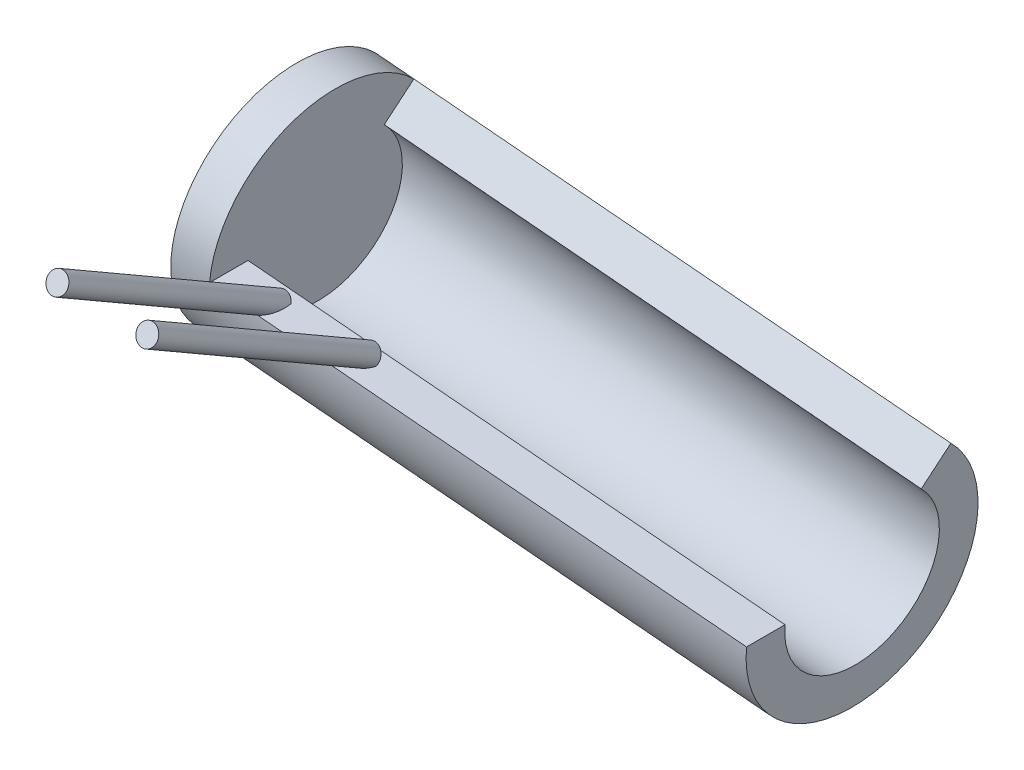
ISO-10303-21;
HEADER;
FILE_DESCRIPTION(('STEP AP214'),'2;1');
FILE_NAME('part.step','',(''),(''),'','','');
FILE_SCHEMA(('AUTOMOTIVE_DESIGN { 1 0 10303 214 1 1 1 1 }'));
ENDSEC;
DATA;
#1=APPLICATION_CONTEXT('core data for automotive mechanical design processes');
#2=APPLICATION_PROTOCOL_DEFINITION('international standard','automotive_design',2000,#1);
#3=PRODUCT_CONTEXT('',#1,'mechanical');
#4=PRODUCT('Part','Part','',(#3));
#5=PRODUCT_RELATED_PRODUCT_CATEGORY('part','',(#4));
#6=PRODUCT_DEFINITION_FORMATION('','',#4);
#7=PRODUCT_DEFINITION_CONTEXT('part definition',#1,'design');
#8=PRODUCT_DEFINITION('design','',#6,#7);
#9=PRODUCT_DEFINITION_SHAPE('','',#8);
#10=(LENGTH_UNIT() NAMED_UNIT(*) SI_UNIT(.MILLI.,.METRE.));
#11=(NAMED_UNIT(*) PLANE_ANGLE_UNIT() SI_UNIT($,.RADIAN.));
#12=(NAMED_UNIT(*) SI_UNIT($,.STERADIAN.) SOLID_ANGLE_UNIT());
#13=UNCERTAINTY_MEASURE_WITH_UNIT(LENGTH_MEASURE(1.E-05),#10,'distance_accuracy_value','');
#14=(GEOMETRIC_REPRESENTATION_CONTEXT(3) GLOBAL_UNCERTAINTY_ASSIGNED_CONTEXT((#13)) GLOBAL_UNIT_ASSIGNED_CONTEXT((#10,
#11,#12)) REPRESENTATION_CONTEXT('',''));
#15=CARTESIAN_POINT('',(0.,0.,0.));
#16=DIRECTION('',(0.,0.,1.));
#17=DIRECTION('',(1.,0.,0.));
#18=AXIS2_PLACEMENT_3D('',#15,#16,#17);
#19=CARTESIAN_POINT('',(-49.8097349045873,4.35778713738258,80.0282655457878));
#20=DIRECTION('',(-0.0871557427476516,-0.996194698091746,0.));
#21=DIRECTION('',(0.996194698091746,-0.0871557427476516,0.));
#22=AXIS2_PLACEMENT_3D('',#19,#20,#21);
#23=PLANE('',#22);
#24=DIRECTION('',(-0.994935885120892,0.0870456108832025,-0.0502558068751915));
#25=VECTOR('',#24,1.);
#26=CARTESIAN_POINT('',(-49.1841625700762,4.30305664989741,67.5487442315924));
#27=LINE('',#26,#25);
#28=CARTESIAN_POINT('',(20.8975157116073,-1.82829572062038,71.0886821732072));
#29=VERTEX_POINT('',#28);
#30=CARTESIAN_POINT('',(13.7488938309381,-1.20287234622851,70.7275938196446));
#31=VERTEX_POINT('',#30);
#32=EDGE_CURVE('E51',#29,#31,#27,.T.);
#33=ORIENTED_EDGE('',*,*,#32,.F.);
#34=CARTESIAN_POINT('',(17.4999999999999,-1.53105161170355,67.3812559662696));
#35=DIRECTION('',(-0.0871557427476516,-0.996194698091746,0.));
#36=DIRECTION('',(0.0500645683573885,-0.00438008217558997,-0.9987363785681));
#37=AXIS2_PLACEMENT_3D('',#34,#35,#36);
#38=ELLIPSE('',#37,8.0305587003471,4.);
#39=EDGE_CURVE('E45',#29,#31,#38,.T.);
#40=ORIENTED_EDGE('',*,*,#39,.T.);
#41=EDGE_LOOP('',(#33,#40));
#42=FACE_BOUND('',#41,.T.);
#43=CARTESIAN_POINT('',(-17.5000000000001,1.53105161170356,72.6849743272314));
#44=DIRECTION('',(-0.0871557427476516,-0.996194698091746,0.));
#45=DIRECTION('',(0.0500645683573885,-0.00438008217558997,-0.9987363785681));
#46=AXIS2_PLACEMENT_3D('',#43,#44,#45);
#47=ELLIPSE('',#46,8.0305587003471,4.);
#48=CARTESIAN_POINT('',(-20.8975157116064,1.8282957206203,68.9775481202904));
#49=VERTEX_POINT('',#48);
#50=CARTESIAN_POINT('',(-19.3831987715752,1.69581015538231,80.0282655457878));
#51=VERTEX_POINT('',#50);
#52=EDGE_CURVE('E59',#49,#51,#47,.F.);
#53=ORIENTED_EDGE('',*,*,#52,.F.);
#54=DIRECTION('',(-0.994935885120892,0.0870456108832025,-0.0502558068751915));
#55=VECTOR('',#54,1.);
#56=CARTESIAN_POINT('',(-49.1841625700762,4.30305664989741,67.5487442315924));
#57=LINE('',#56,#55);
#58=CARTESIAN_POINT('',(-13.7488938309388,1.20287234622857,69.338636473853));
#59=VERTEX_POINT('',#58);
#60=EDGE_CURVE('E120',#59,#49,#57,.T.);
#61=ORIENTED_EDGE('',*,*,#60,.F.);
#62=CARTESIAN_POINT('',(-16.1700075579629,1.41469235045015,80.0282655457878));
#63=VERTEX_POINT('',#62);
#64=EDGE_CURVE('E108',#63,#59,#47,.F.);
#65=ORIENTED_EDGE('',*,*,#64,.F.);
#66=DIRECTION('',(0.996194698091746,-0.0871557427476516,0.));
#67=VECTOR('',#66,1.);
#68=CARTESIAN_POINT('',(-49.8097349045873,4.35778713738258,80.0282655457878));
#69=LINE('',#68,#67);
#70=CARTESIAN_POINT('',(174.334072166056,-15.252254980839,80.0282655457878));
#71=VERTEX_POINT('',#70);
#72=EDGE_CURVE('E111',#63,#71,#69,.T.);
#73=ORIENTED_EDGE('',*,*,#72,.T.);
#74=DIRECTION('',(0.,0.,-1.));
#75=VECTOR('',#74,1.);
#76=CARTESIAN_POINT('',(174.334072166056,-15.252254980839,80.0282655457878));
#77=LINE('',#76,#75);
#78=CARTESIAN_POINT('',(174.334072166056,-15.252254980839,65.0282655457878));
#79=VERTEX_POINT('',#78);
#80=EDGE_CURVE('E141',#71,#79,#77,.T.);
#81=ORIENTED_EDGE('',*,*,#80,.T.);
#82=DIRECTION('',(0.996194698091746,-0.0871557427476516,0.));
#83=VECTOR('',#82,1.);
#84=CARTESIAN_POINT('',(-49.8097349045873,4.35778713738258,65.0282655457878));
#85=LINE('',#84,#83);
#86=CARTESIAN_POINT('',(-34.8668144332111,3.0504509961678,65.0282655457878));
#87=VERTEX_POINT('',#86);
#88=EDGE_CURVE('E118',#87,#79,#85,.T.);
#89=ORIENTED_EDGE('',*,*,#88,.F.);
#90=DIRECTION('',(0.,0.,-1.));
#91=VECTOR('',#90,1.);
#92=CARTESIAN_POINT('',(-34.8668144332111,3.05045099616781,80.0282655457878));
#93=LINE('',#92,#91);
#94=CARTESIAN_POINT('',(-34.8668144332111,3.05045099616781,80.0282655457878));
#95=VERTEX_POINT('',#94);
#96=EDGE_CURVE('E130',#95,#87,#93,.T.);
#97=ORIENTED_EDGE('',*,*,#96,.F.);
#98=EDGE_CURVE('E117',#95,#51,#69,.T.);
#99=ORIENTED_EDGE('',*,*,#98,.T.);
#100=EDGE_LOOP('',(#53,#61,#65,#73,#81,#89,#97,#99));
#101=FACE_BOUND('',#100,.T.);
#102=ADVANCED_FACE('F37',(#42,#101),#23,.F.);
#103=CARTESIAN_POINT('',(-49.8097349045873,4.35778713738258,35.0165575733746));
#104=DIRECTION('',(0.996194698091746,-0.0871557427476516,0.));
#105=DIRECTION('',(0.0871557427476516,0.996194698091746,0.));
#106=AXIS2_PLACEMENT_3D('',#103,#104,#105);
#107=CYLINDRICAL_SURFACE('',#106,45.0117079724132);
#108=CARTESIAN_POINT('',(-49.8097349045873,4.35778713738258,35.0165575733746));
#109=DIRECTION('',(-0.996194698091746,0.0871557427476516,0.));
#110=DIRECTION('',(-0.0871557427476516,-0.996194698091746,0.));
#111=AXIS2_PLACEMENT_3D('',#108,#109,#110);
#112=CIRCLE('',#111,45.0117079724132);
#113=CARTESIAN_POINT('',(-53.7327637452634,-40.4826376967894,35.0165575733746));
#114=VERTEX_POINT('',#113);
#115=EDGE_CURVE('E144',#114,#114,#112,.T.);
#116=ORIENTED_EDGE('',*,*,#115,.F.);
#117=EDGE_LOOP('',(#116));
#118=FACE_BOUND('',#117,.T.);
#119=CARTESIAN_POINT('',(-34.8668144332111,3.05045099616781,35.0165575733746));
#120=DIRECTION('',(-0.996194698091746,0.0871557427476516,0.));
#121=DIRECTION('',(-0.0871557427476516,-0.996194698091746,0.));
#122=AXIS2_PLACEMENT_3D('',#119,#120,#121);
#123=CIRCLE('',#122,45.0117079724132);
#124=CARTESIAN_POINT('',(-32.0928141371787,34.7574194676965,3.18847363329267));
#125=VERTEX_POINT('',#124);
#126=EDGE_CURVE('E123',#95,#125,#123,.T.);
#127=ORIENTED_EDGE('',*,*,#126,.T.);
#128=DIRECTION('',(0.996194698091746,-0.0871557427476516,0.));
#129=VECTOR('',#128,1.);
#130=CARTESIAN_POINT('',(-47.0357346085549,36.0647556089113,3.18847363329267));
#131=LINE('',#130,#129);
#132=CARTESIAN_POINT('',(177.108072462088,16.4547134906897,3.18847363329267));
#133=VERTEX_POINT('',#132);
#134=EDGE_CURVE('E148',#125,#133,#131,.T.);
#135=ORIENTED_EDGE('',*,*,#134,.T.);
#136=CARTESIAN_POINT('',(174.334072166056,-15.252254980839,35.0165575733746));
#137=DIRECTION('',(-0.996194698091746,0.0871557427476516,0.));
#138=DIRECTION('',(-0.0871557427476516,-0.996194698091746,0.));
#139=AXIS2_PLACEMENT_3D('',#136,#137,#138);
#140=CIRCLE('',#139,45.0117079724132);
#141=EDGE_CURVE('E114',#133,#71,#140,.T.);
#142=ORIENTED_EDGE('',*,*,#141,.T.);
#143=ORIENTED_EDGE('',*,*,#72,.F.);
#144=DIRECTION('',(0.996194698091746,-0.0871557427476516,0.));
#145=VECTOR('',#144,1.);
#146=CARTESIAN_POINT('',(-523.310004626291,45.7836929144958,80.0282655457878));
#147=LINE('',#146,#145);
#148=EDGE_CURVE('E96',#51,#63,#147,.T.);
#149=ORIENTED_EDGE('',*,*,#148,.F.);
#150=ORIENTED_EDGE('',*,*,#98,.F.);
#151=EDGE_LOOP('',(#127,#135,#142,#143,#149,#150));
#152=FACE_BOUND('',#151,.T.);
#153=ADVANCED_FACE('F112',(#118,#152),#107,.T.);
#154=CARTESIAN_POINT('',(-47.0357346085549,36.0647556089112,3.18847363329267));
#155=DIRECTION('',(0.0616284167162147,0.704416026402759,0.707106781186547));
#156=DIRECTION('',(0.,-0.708453436019948,0.705757556807952));
#157=AXIS2_PLACEMENT_3D('',#154,#155,#156);
#158=PLANE('',#157);
#159=ORIENTED_EDGE('',*,*,#134,.F.);
#160=DIRECTION('',(-0.0616284167162147,-0.704416026402759,0.707106781186548));
#161=VECTOR('',#160,1.);
#162=CARTESIAN_POINT('',(-32.0928141371787,34.7574194676965,3.18847363329267));
#163=LINE('',#162,#161);
#164=CARTESIAN_POINT('',(-33.0172403879219,24.1911790716551,13.7950753510909));
#165=VERTEX_POINT('',#164);
#166=EDGE_CURVE('E133',#125,#165,#163,.T.);
#167=ORIENTED_EDGE('',*,*,#166,.T.);
#168=DIRECTION('',(0.996194698091746,-0.0871557427476516,0.));
#169=VECTOR('',#168,1.);
#170=CARTESIAN_POINT('',(-47.9601608592981,25.4985152128699,13.7950753510909));
#171=LINE('',#170,#169);
#172=CARTESIAN_POINT('',(176.183646211345,5.88847309464828,13.7950753510909));
#173=VERTEX_POINT('',#172);
#174=EDGE_CURVE('E147',#165,#173,#171,.T.);
#175=ORIENTED_EDGE('',*,*,#174,.T.);
#176=DIRECTION('',(-0.0616284167162147,-0.704416026402759,0.707106781186547));
#177=VECTOR('',#176,1.);
#178=CARTESIAN_POINT('',(177.108072462088,16.4547134906897,3.18847363329267));
#179=LINE('',#178,#177);
#180=EDGE_CURVE('E135',#133,#173,#179,.T.);
#181=ORIENTED_EDGE('',*,*,#180,.F.);
#182=EDGE_LOOP('',(#159,#167,#175,#181));
#183=FACE_BOUND('',#182,.T.);
#184=ADVANCED_FACE('F39',(#183),#158,.T.);
#185=CARTESIAN_POINT('',(-49.8097349045873,4.35778713738258,35.0165575733746));
#186=DIRECTION('',(0.996194698091746,-0.0871557427476516,0.));
#187=DIRECTION('',(0.0871557427476516,0.996194698091746,0.));
#188=AXIS2_PLACEMENT_3D('',#185,#186,#187);
#189=CYLINDRICAL_SURFACE('',#188,30.0117079724132);
#190=ORIENTED_EDGE('',*,*,#174,.F.);
#191=CARTESIAN_POINT('',(-34.8668144332111,3.05045099616781,35.0165575733746));
#192=DIRECTION('',(-0.996194698091746,0.0871557427476516,0.));
#193=DIRECTION('',(-0.0871557427476516,-0.996194698091746,0.));
#194=AXIS2_PLACEMENT_3D('',#191,#192,#193);
#195=CIRCLE('',#194,30.0117079724132);
#196=EDGE_CURVE('E149',#165,#87,#195,.T.);
#197=ORIENTED_EDGE('',*,*,#196,.T.);
#198=ORIENTED_EDGE('',*,*,#88,.T.);
#199=CARTESIAN_POINT('',(174.334072166056,-15.252254980839,35.0165575733746));
#200=DIRECTION('',(-0.996194698091746,0.0871557427476516,0.));
#201=DIRECTION('',(-0.0871557427476516,-0.996194698091746,0.));
#202=AXIS2_PLACEMENT_3D('',#199,#200,#201);
#203=CIRCLE('',#202,30.0117079724132);
#204=EDGE_CURVE('E138',#173,#79,#203,.T.);
#205=ORIENTED_EDGE('',*,*,#204,.F.);
#206=EDGE_LOOP('',(#190,#197,#198,#205));
#207=FACE_BOUND('',#206,.T.);
#208=ADVANCED_FACE('F191',(#207),#189,.F.);
#209=CARTESIAN_POINT('',(-49.8097349045873,4.35778713738258,35.0165575733746));
#210=DIRECTION('',(-0.996194698091746,0.0871557427476516,0.));
#211=DIRECTION('',(-0.0871557427476516,-0.996194698091746,0.));
#212=AXIS2_PLACEMENT_3D('',#209,#210,#211);
#213=PLANE('',#212);
#214=ORIENTED_EDGE('',*,*,#115,.T.);
#215=EDGE_LOOP('',(#214));
#216=FACE_BOUND('',#215,.T.);
#217=ADVANCED_FACE('F193',(#216),#213,.T.);
#218=CARTESIAN_POINT('',(174.334072166056,-15.252254980839,35.0165575733746));
#219=DIRECTION('',(-0.996194698091746,0.0871557427476516,0.));
#220=DIRECTION('',(-0.0871557427476516,-0.996194698091746,0.));
#221=AXIS2_PLACEMENT_3D('',#218,#219,#220);
#222=PLANE('',#221);
#223=ORIENTED_EDGE('',*,*,#180,.T.);
#224=ORIENTED_EDGE('',*,*,#204,.T.);
#225=ORIENTED_EDGE('',*,*,#80,.F.);
#226=ORIENTED_EDGE('',*,*,#141,.F.);
#227=EDGE_LOOP('',(#223,#224,#225,#226));
#228=FACE_BOUND('',#227,.T.);
#229=ADVANCED_FACE('F179',(#228),#222,.F.);
#230=CARTESIAN_POINT('',(-34.8668144332111,3.05045099616781,35.0165575733746));
#231=DIRECTION('',(-0.996194698091746,0.0871557427476516,0.));
#232=DIRECTION('',(-0.0871557427476516,-0.996194698091746,0.));
#233=AXIS2_PLACEMENT_3D('',#230,#231,#232);
#234=PLANE('',#233);
#235=ORIENTED_EDGE('',*,*,#96,.T.);
#236=ORIENTED_EDGE('',*,*,#196,.F.);
#237=ORIENTED_EDGE('',*,*,#166,.F.);
#238=ORIENTED_EDGE('',*,*,#126,.F.);
#239=EDGE_LOOP('',(#235,#236,#237,#238));
#240=FACE_BOUND('',#239,.T.);
#241=ADVANCED_FACE('F170',(#240),#234,.F.);
#242=CARTESIAN_POINT('',(0.,-7.2500409600031E-13,70.0331151467492));
#243=DIRECTION('',(0.,0.49999999999998,0.86602540378445));
#244=DIRECTION('',(0.,0.86602540378445,-0.49999999999998));
#245=AXIS2_PLACEMENT_3D('',#242,#243,#244);
#246=PLANE('',#245);
#247=CARTESIAN_POINT('',(-17.5000000000001,-7.27606181214275E-13,70.0331151467492));
#248=DIRECTION('',(0.,-0.49999999999998,-0.86602540378445));
#249=DIRECTION('',(0.,0.86602540378445,-0.49999999999998));
#250=AXIS2_PLACEMENT_3D('',#247,#248,#249);
#251=CIRCLE('',#250,4.);
#252=EDGE_CURVE('E125',#59,#49,#251,.F.);
#253=ORIENTED_EDGE('',*,*,#252,.F.);
#254=ORIENTED_EDGE('',*,*,#60,.T.);
#255=EDGE_LOOP('',(#253,#254));
#256=FACE_BOUND('',#255,.T.);
#257=ADVANCED_FACE('F168',(#256),#246,.F.);
#258=CARTESIAN_POINT('',(-17.5000000000002,49.9999999999973,156.635655525194));
#259=DIRECTION('',(0.,-0.49999999999998,-0.86602540378445));
#260=DIRECTION('',(0.,0.86602540378445,-0.49999999999998));
#261=AXIS2_PLACEMENT_3D('',#258,#259,#260);
#262=CYLINDRICAL_SURFACE('',#261,4.);
#263=CARTESIAN_POINT('',(-17.5000000000002,49.9999999999973,156.635655525194));
#264=DIRECTION('',(0.,-0.49999999999998,-0.86602540378445));
#265=DIRECTION('',(0.,0.86602540378445,-0.49999999999998));
#266=AXIS2_PLACEMENT_3D('',#263,#264,#265);
#267=CIRCLE('',#266,4.);
#268=CARTESIAN_POINT('',(-17.5000000000002,53.4641016151351,154.635655525194));
#269=VERTEX_POINT('',#268);
#270=EDGE_CURVE('E121',#269,#269,#267,.F.);
#271=ORIENTED_EDGE('',*,*,#270,.F.);
#272=EDGE_LOOP('',(#271));
#273=FACE_BOUND('',#272,.T.);
#274=ORIENTED_EDGE('',*,*,#52,.T.);
#275=CARTESIAN_POINT('',(-17.5000000000001,1.53105161170355,72.6849743272314));
#276=DIRECTION('',(0.0871557427476516,0.996194698091746,0.));
#277=DIRECTION('',(0.0500645683573885,-0.00438008217558986,-0.9987363785681));
#278=AXIS2_PLACEMENT_3D('',#275,#276,#277);
#279=ELLIPSE('',#278,8.0305587003471,4.);
#280=EDGE_CURVE('E11',#51,#63,#279,.T.);
#281=ORIENTED_EDGE('',*,*,#280,.T.);
#282=ORIENTED_EDGE('',*,*,#64,.T.);
#283=ORIENTED_EDGE('',*,*,#252,.T.);
#284=EDGE_LOOP('',(#274,#281,#282,#283));
#285=FACE_BOUND('',#284,.T.);
#286=ADVANCED_FACE('F105',(#273,#285),#262,.T.);
#287=CARTESIAN_POINT('',(-2.20566641786847E-13,49.9999999999973,156.635655525194));
#288=DIRECTION('',(0.,0.49999999999998,0.86602540378445));
#289=DIRECTION('',(0.,0.86602540378445,-0.49999999999998));
#290=AXIS2_PLACEMENT_3D('',#287,#288,#289);
#291=PLANE('',#290);
#292=ORIENTED_EDGE('',*,*,#270,.T.);
#293=EDGE_LOOP('',(#292));
#294=FACE_BOUND('',#293,.T.);
#295=ADVANCED_FACE('F176',(#294),#291,.T.);
#296=CARTESIAN_POINT('',(17.4999999999998,49.9999999999973,156.635655525194));
#297=DIRECTION('',(0.,-0.49999999999998,-0.86602540378445));
#298=DIRECTION('',(0.,0.86602540378445,-0.49999999999998));
#299=AXIS2_PLACEMENT_3D('',#296,#297,#298);
#300=CYLINDRICAL_SURFACE('',#299,4.);
#301=CARTESIAN_POINT('',(17.4999999999998,49.9999999999973,156.635655525194));
#302=DIRECTION('',(0.,-0.49999999999998,-0.86602540378445));
#303=DIRECTION('',(0.,0.86602540378445,-0.49999999999998));
#304=AXIS2_PLACEMENT_3D('',#301,#302,#303);
#305=CIRCLE('',#304,4.);
#306=CARTESIAN_POINT('',(17.4999999999998,53.4641016151351,154.635655525194));
#307=VERTEX_POINT('',#306);
#308=EDGE_CURVE('E161',#307,#307,#305,.T.);
#309=ORIENTED_EDGE('',*,*,#308,.T.);
#310=EDGE_LOOP('',(#309));
#311=FACE_BOUND('',#310,.T.);
#312=ORIENTED_EDGE('',*,*,#39,.F.);
#313=CARTESIAN_POINT('',(17.4999999999999,-7.27606181214276E-13,70.0331151467492));
#314=DIRECTION('',(0.,-0.49999999999998,-0.86602540378445));
#315=DIRECTION('',(0.,0.86602540378445,-0.49999999999998));
#316=AXIS2_PLACEMENT_3D('',#313,#314,#315);
#317=CIRCLE('',#316,4.);
#318=EDGE_CURVE('E101',#31,#29,#317,.T.);
#319=ORIENTED_EDGE('',*,*,#318,.F.);
#320=EDGE_LOOP('',(#312,#319));
#321=FACE_BOUND('',#320,.T.);
#322=ADVANCED_FACE('F160',(#311,#321),#300,.T.);
#323=CARTESIAN_POINT('',(0.,-7.2500409600031E-13,70.0331151467492));
#324=DIRECTION('',(0.,0.49999999999998,0.86602540378445));
#325=DIRECTION('',(0.,0.86602540378445,-0.49999999999998));
#326=AXIS2_PLACEMENT_3D('',#323,#324,#325);
#327=PLANE('',#326);
#328=ORIENTED_EDGE('',*,*,#318,.T.);
#329=ORIENTED_EDGE('',*,*,#32,.T.);
#330=EDGE_LOOP('',(#328,#329));
#331=FACE_BOUND('',#330,.T.);
#332=ADVANCED_FACE('F159',(#331),#327,.F.);
#333=CARTESIAN_POINT('',(-2.20566641786847E-13,49.9999999999973,156.635655525194));
#334=DIRECTION('',(0.,0.49999999999998,0.86602540378445));
#335=DIRECTION('',(0.,0.86602540378445,-0.49999999999998));
#336=AXIS2_PLACEMENT_3D('',#333,#334,#335);
#337=PLANE('',#336);
#338=ORIENTED_EDGE('',*,*,#308,.F.);
#339=EDGE_LOOP('',(#338));
#340=FACE_BOUND('',#339,.T.);
#341=ADVANCED_FACE('F243',(#340),#337,.T.);
#342=CARTESIAN_POINT('',(-523.310004626291,45.7836929144958,80.0282655457878));
#343=DIRECTION('',(0.0871557427476516,0.996194698091746,0.));
#344=DIRECTION('',(-0.996194698091746,0.0871557427476516,0.));
#345=AXIS2_PLACEMENT_3D('',#342,#343,#344);
#346=PLANE('',#345);
#347=ORIENTED_EDGE('',*,*,#148,.T.);
#348=ORIENTED_EDGE('',*,*,#280,.F.);
#349=EDGE_LOOP('',(#347,#348));
#350=FACE_BOUND('',#349,.T.);
#351=ADVANCED_FACE('F97',(#350),#346,.F.);
#352=CLOSED_SHELL('',(#102,#153,#184,#208,#217,#229,#241,#257,#286,#295,#322,#332,#341,#351));
#353=MANIFOLD_SOLID_BREP('B2',#352);
#354=ADVANCED_BREP_SHAPE_REPRESENTATION('',(#18,#353),#14);
#355=SHAPE_DEFINITION_REPRESENTATION(#9,#354);
ENDSEC;
END-ISO-10303-21;
